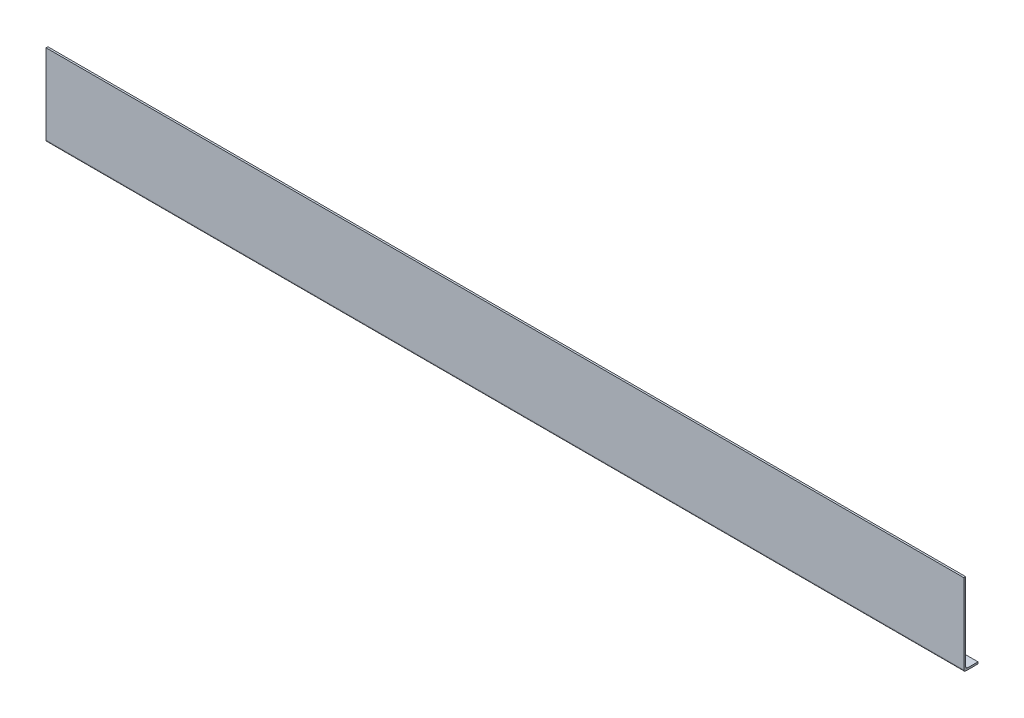
ISO-10303-21;
HEADER;
FILE_DESCRIPTION(('STEP AP214'),'2;1');
FILE_NAME('part.step','',(''),(''),'','','');
FILE_SCHEMA(('AUTOMOTIVE_DESIGN { 1 0 10303 214 1 1 1 1 }'));
ENDSEC;
DATA;
#1=APPLICATION_CONTEXT('core data for automotive mechanical design processes');
#2=APPLICATION_PROTOCOL_DEFINITION('international standard','automotive_design',2000,#1);
#3=PRODUCT_CONTEXT('',#1,'mechanical');
#4=PRODUCT('Part','Part','',(#3));
#5=PRODUCT_RELATED_PRODUCT_CATEGORY('part','',(#4));
#6=PRODUCT_DEFINITION_FORMATION('','',#4);
#7=PRODUCT_DEFINITION_CONTEXT('part definition',#1,'design');
#8=PRODUCT_DEFINITION('design','',#6,#7);
#9=PRODUCT_DEFINITION_SHAPE('','',#8);
#10=(LENGTH_UNIT() NAMED_UNIT(*) SI_UNIT(.MILLI.,.METRE.));
#11=(NAMED_UNIT(*) PLANE_ANGLE_UNIT() SI_UNIT($,.RADIAN.));
#12=(NAMED_UNIT(*) SI_UNIT($,.STERADIAN.) SOLID_ANGLE_UNIT());
#13=UNCERTAINTY_MEASURE_WITH_UNIT(LENGTH_MEASURE(1.E-05),#10,'distance_accuracy_value','');
#14=(GEOMETRIC_REPRESENTATION_CONTEXT(3) GLOBAL_UNCERTAINTY_ASSIGNED_CONTEXT((#13)) GLOBAL_UNIT_ASSIGNED_CONTEXT((#10,
#11,#12)) REPRESENTATION_CONTEXT('',''));
#15=CARTESIAN_POINT('',(0.,0.,0.));
#16=DIRECTION('',(0.,0.,1.));
#17=DIRECTION('',(1.,0.,0.));
#18=AXIS2_PLACEMENT_3D('',#15,#16,#17);
#19=CARTESIAN_POINT('',(1493.,3.,0.));
#20=DIRECTION('',(0.,0.,1.));
#21=DIRECTION('',(1.,0.,0.));
#22=AXIS2_PLACEMENT_3D('',#19,#20,#21);
#23=PLANE('',#22);
#24=DIRECTION('',(0.,1.,0.));
#25=VECTOR('',#24,1.);
#26=CARTESIAN_POINT('',(0.,3.,0.));
#27=LINE('',#26,#25);
#28=CARTESIAN_POINT('',(0.,0.,0.));
#29=VERTEX_POINT('',#28);
#30=CARTESIAN_POINT('',(0.,3.,0.));
#31=VERTEX_POINT('',#30);
#32=EDGE_CURVE('E123',#29,#31,#27,.T.);
#33=ORIENTED_EDGE('',*,*,#32,.T.);
#34=DIRECTION('',(-1.,0.,0.));
#35=VECTOR('',#34,1.);
#36=CARTESIAN_POINT('',(1493.,3.,0.));
#37=LINE('',#36,#35);
#38=CARTESIAN_POINT('',(1493.,3.,0.));
#39=VERTEX_POINT('',#38);
#40=EDGE_CURVE('E104',#39,#31,#37,.T.);
#41=ORIENTED_EDGE('',*,*,#40,.F.);
#42=DIRECTION('',(0.,1.,0.));
#43=VECTOR('',#42,1.);
#44=CARTESIAN_POINT('',(1493.,3.,0.));
#45=LINE('',#44,#43);
#46=CARTESIAN_POINT('',(1493.,0.,0.));
#47=VERTEX_POINT('',#46);
#48=EDGE_CURVE('E111',#47,#39,#45,.T.);
#49=ORIENTED_EDGE('',*,*,#48,.F.);
#50=DIRECTION('',(-1.,0.,0.));
#51=VECTOR('',#50,1.);
#52=CARTESIAN_POINT('',(1493.,0.,0.));
#53=LINE('',#52,#51);
#54=EDGE_CURVE('E162',#47,#29,#53,.T.);
#55=ORIENTED_EDGE('',*,*,#54,.T.);
#56=EDGE_LOOP('',(#33,#41,#49,#55));
#57=FACE_BOUND('',#56,.T.);
#58=ADVANCED_FACE('F33',(#57),#23,.F.);
#59=CARTESIAN_POINT('',(1493.,3.,0.));
#60=DIRECTION('',(0.,-1.,0.));
#61=DIRECTION('',(0.,0.,-1.));
#62=AXIS2_PLACEMENT_3D('',#59,#60,#61);
#63=PLANE('',#62);
#64=DIRECTION('',(0.,0.,1.));
#65=VECTOR('',#64,1.);
#66=CARTESIAN_POINT('',(0.,3.,0.));
#67=LINE('',#66,#65);
#68=CARTESIAN_POINT('',(0.,3.,17.));
#69=VERTEX_POINT('',#68);
#70=EDGE_CURVE('E143',#31,#69,#67,.T.);
#71=ORIENTED_EDGE('',*,*,#70,.T.);
#72=DIRECTION('',(-1.,0.,0.));
#73=VECTOR('',#72,1.);
#74=CARTESIAN_POINT('',(1493.,3.,17.));
#75=LINE('',#74,#73);
#76=CARTESIAN_POINT('',(1493.,3.,17.));
#77=VERTEX_POINT('',#76);
#78=EDGE_CURVE('E107',#69,#77,#75,.F.);
#79=ORIENTED_EDGE('',*,*,#78,.T.);
#80=DIRECTION('',(0.,0.,1.));
#81=VECTOR('',#80,1.);
#82=CARTESIAN_POINT('',(1493.,3.,0.));
#83=LINE('',#82,#81);
#84=EDGE_CURVE('E99',#39,#77,#83,.T.);
#85=ORIENTED_EDGE('',*,*,#84,.F.);
#86=ORIENTED_EDGE('',*,*,#40,.T.);
#87=EDGE_LOOP('',(#71,#79,#85,#86));
#88=FACE_BOUND('',#87,.T.);
#89=ADVANCED_FACE('F102',(#88),#63,.F.);
#90=CARTESIAN_POINT('',(1493.,3.,20.));
#91=DIRECTION('',(0.,0.,1.));
#92=DIRECTION('',(1.,0.,0.));
#93=AXIS2_PLACEMENT_3D('',#90,#91,#92);
#94=PLANE('',#93);
#95=DIRECTION('',(0.,1.,0.));
#96=VECTOR('',#95,1.);
#97=CARTESIAN_POINT('',(1493.,3.,20.));
#98=LINE('',#97,#96);
#99=CARTESIAN_POINT('',(1493.,6.,20.));
#100=VERTEX_POINT('',#99);
#101=CARTESIAN_POINT('',(1493.,133.,20.));
#102=VERTEX_POINT('',#101);
#103=EDGE_CURVE('E110',#100,#102,#98,.T.);
#104=ORIENTED_EDGE('',*,*,#103,.F.);
#105=DIRECTION('',(-1.,0.,0.));
#106=VECTOR('',#105,1.);
#107=CARTESIAN_POINT('',(0.,6.,20.));
#108=LINE('',#107,#106);
#109=CARTESIAN_POINT('',(0.,6.,20.));
#110=VERTEX_POINT('',#109);
#111=EDGE_CURVE('E124',#100,#110,#108,.T.);
#112=ORIENTED_EDGE('',*,*,#111,.T.);
#113=DIRECTION('',(0.,1.,0.));
#114=VECTOR('',#113,1.);
#115=CARTESIAN_POINT('',(0.,3.,20.));
#116=LINE('',#115,#114);
#117=CARTESIAN_POINT('',(0.,133.,20.));
#118=VERTEX_POINT('',#117);
#119=EDGE_CURVE('E145',#110,#118,#116,.T.);
#120=ORIENTED_EDGE('',*,*,#119,.T.);
#121=DIRECTION('',(-1.,0.,0.));
#122=VECTOR('',#121,1.);
#123=CARTESIAN_POINT('',(1493.,133.,20.));
#124=LINE('',#123,#122);
#125=EDGE_CURVE('E125',#102,#118,#124,.T.);
#126=ORIENTED_EDGE('',*,*,#125,.F.);
#127=EDGE_LOOP('',(#104,#112,#120,#126));
#128=FACE_BOUND('',#127,.T.);
#129=ADVANCED_FACE('F153',(#128),#94,.F.);
#130=CARTESIAN_POINT('',(1493.,133.,23.));
#131=DIRECTION('',(0.,-1.,0.));
#132=DIRECTION('',(0.,0.,-1.));
#133=AXIS2_PLACEMENT_3D('',#130,#131,#132);
#134=PLANE('',#133);
#135=DIRECTION('',(0.,0.,1.));
#136=VECTOR('',#135,1.);
#137=CARTESIAN_POINT('',(0.,133.,23.));
#138=LINE('',#137,#136);
#139=CARTESIAN_POINT('',(0.,133.,23.));
#140=VERTEX_POINT('',#139);
#141=EDGE_CURVE('E165',#118,#140,#138,.T.);
#142=ORIENTED_EDGE('',*,*,#141,.T.);
#143=DIRECTION('',(-1.,0.,0.));
#144=VECTOR('',#143,1.);
#145=CARTESIAN_POINT('',(1493.,133.,23.));
#146=LINE('',#145,#144);
#147=CARTESIAN_POINT('',(1493.,133.,23.));
#148=VERTEX_POINT('',#147);
#149=EDGE_CURVE('E130',#148,#140,#146,.T.);
#150=ORIENTED_EDGE('',*,*,#149,.F.);
#151=DIRECTION('',(0.,0.,1.));
#152=VECTOR('',#151,1.);
#153=CARTESIAN_POINT('',(1493.,133.,23.));
#154=LINE('',#153,#152);
#155=EDGE_CURVE('E155',#102,#148,#154,.T.);
#156=ORIENTED_EDGE('',*,*,#155,.F.);
#157=ORIENTED_EDGE('',*,*,#125,.T.);
#158=EDGE_LOOP('',(#142,#150,#156,#157));
#159=FACE_BOUND('',#158,.T.);
#160=ADVANCED_FACE('F174',(#159),#134,.F.);
#161=CARTESIAN_POINT('',(1493.,0.,23.));
#162=DIRECTION('',(0.,0.,-1.));
#163=DIRECTION('',(-1.,0.,0.));
#164=AXIS2_PLACEMENT_3D('',#161,#162,#163);
#165=PLANE('',#164);
#166=DIRECTION('',(0.,-1.,0.));
#167=VECTOR('',#166,1.);
#168=CARTESIAN_POINT('',(0.,0.,23.));
#169=LINE('',#168,#167);
#170=CARTESIAN_POINT('',(0.,3.,23.));
#171=VERTEX_POINT('',#170);
#172=EDGE_CURVE('E167',#140,#171,#169,.T.);
#173=ORIENTED_EDGE('',*,*,#172,.T.);
#174=DIRECTION('',(-1.,0.,0.));
#175=VECTOR('',#174,1.);
#176=CARTESIAN_POINT('',(1493.,3.,23.));
#177=LINE('',#176,#175);
#178=CARTESIAN_POINT('',(1493.,3.,23.));
#179=VERTEX_POINT('',#178);
#180=EDGE_CURVE('E48',#171,#179,#177,.F.);
#181=ORIENTED_EDGE('',*,*,#180,.T.);
#182=DIRECTION('',(0.,-1.,0.));
#183=VECTOR('',#182,1.);
#184=CARTESIAN_POINT('',(1493.,0.,23.));
#185=LINE('',#184,#183);
#186=EDGE_CURVE('E157',#148,#179,#185,.T.);
#187=ORIENTED_EDGE('',*,*,#186,.F.);
#188=ORIENTED_EDGE('',*,*,#149,.T.);
#189=EDGE_LOOP('',(#173,#181,#187,#188));
#190=FACE_BOUND('',#189,.T.);
#191=ADVANCED_FACE('F172',(#190),#165,.F.);
#192=CARTESIAN_POINT('',(1493.,0.,0.));
#193=DIRECTION('',(0.,1.,0.));
#194=DIRECTION('',(0.,0.,1.));
#195=AXIS2_PLACEMENT_3D('',#192,#193,#194);
#196=PLANE('',#195);
#197=DIRECTION('',(0.,0.,-1.));
#198=VECTOR('',#197,1.);
#199=CARTESIAN_POINT('',(1493.,0.,0.));
#200=LINE('',#199,#198);
#201=CARTESIAN_POINT('',(1493.,0.,20.));
#202=VERTEX_POINT('',#201);
#203=EDGE_CURVE('E116',#202,#47,#200,.T.);
#204=ORIENTED_EDGE('',*,*,#203,.F.);
#205=DIRECTION('',(-1.,0.,0.));
#206=VECTOR('',#205,1.);
#207=CARTESIAN_POINT('',(1493.,0.,20.));
#208=LINE('',#207,#206);
#209=CARTESIAN_POINT('',(0.,0.,20.));
#210=VERTEX_POINT('',#209);
#211=EDGE_CURVE('E135',#202,#210,#208,.T.);
#212=ORIENTED_EDGE('',*,*,#211,.T.);
#213=DIRECTION('',(0.,0.,-1.));
#214=VECTOR('',#213,1.);
#215=CARTESIAN_POINT('',(0.,0.,0.));
#216=LINE('',#215,#214);
#217=EDGE_CURVE('E120',#210,#29,#216,.T.);
#218=ORIENTED_EDGE('',*,*,#217,.T.);
#219=ORIENTED_EDGE('',*,*,#54,.F.);
#220=EDGE_LOOP('',(#204,#212,#218,#219));
#221=FACE_BOUND('',#220,.T.);
#222=ADVANCED_FACE('F179',(#221),#196,.F.);
#223=CARTESIAN_POINT('',(1493.,0.,0.));
#224=DIRECTION('',(-1.,0.,0.));
#225=DIRECTION('',(0.,0.,1.));
#226=AXIS2_PLACEMENT_3D('',#223,#224,#225);
#227=PLANE('',#226);
#228=ORIENTED_EDGE('',*,*,#186,.T.);
#229=CARTESIAN_POINT('',(1493.,3.,20.));
#230=DIRECTION('',(-1.,0.,0.));
#231=DIRECTION('',(0.,0.,1.));
#232=AXIS2_PLACEMENT_3D('',#229,#230,#231);
#233=CIRCLE('',#232,3.);
#234=EDGE_CURVE('E140',#179,#202,#233,.F.);
#235=ORIENTED_EDGE('',*,*,#234,.T.);
#236=ORIENTED_EDGE('',*,*,#203,.T.);
#237=ORIENTED_EDGE('',*,*,#48,.T.);
#238=ORIENTED_EDGE('',*,*,#84,.T.);
#239=CARTESIAN_POINT('',(1493.,6.,17.));
#240=DIRECTION('',(-1.,0.,0.));
#241=DIRECTION('',(0.,0.,1.));
#242=AXIS2_PLACEMENT_3D('',#239,#240,#241);
#243=CIRCLE('',#242,3.);
#244=EDGE_CURVE('E11',#77,#100,#243,.T.);
#245=ORIENTED_EDGE('',*,*,#244,.T.);
#246=ORIENTED_EDGE('',*,*,#103,.T.);
#247=ORIENTED_EDGE('',*,*,#155,.T.);
#248=EDGE_LOOP('',(#228,#235,#236,#237,#238,#245,#246,#247));
#249=FACE_BOUND('',#248,.T.);
#250=ADVANCED_FACE('F114',(#249),#227,.F.);
#251=CARTESIAN_POINT('',(0.,0.,0.));
#252=DIRECTION('',(-1.,0.,0.));
#253=DIRECTION('',(0.,0.,1.));
#254=AXIS2_PLACEMENT_3D('',#251,#252,#253);
#255=PLANE('',#254);
#256=ORIENTED_EDGE('',*,*,#217,.F.);
#257=CARTESIAN_POINT('',(0.,3.,20.));
#258=DIRECTION('',(-1.,0.,0.));
#259=DIRECTION('',(0.,0.,1.));
#260=AXIS2_PLACEMENT_3D('',#257,#258,#259);
#261=CIRCLE('',#260,3.);
#262=EDGE_CURVE('E56',#210,#171,#261,.T.);
#263=ORIENTED_EDGE('',*,*,#262,.T.);
#264=ORIENTED_EDGE('',*,*,#172,.F.);
#265=ORIENTED_EDGE('',*,*,#141,.F.);
#266=ORIENTED_EDGE('',*,*,#119,.F.);
#267=CARTESIAN_POINT('',(0.,6.,17.));
#268=DIRECTION('',(-1.,0.,0.));
#269=DIRECTION('',(0.,0.,1.));
#270=AXIS2_PLACEMENT_3D('',#267,#268,#269);
#271=CIRCLE('',#270,3.);
#272=EDGE_CURVE('E41',#110,#69,#271,.F.);
#273=ORIENTED_EDGE('',*,*,#272,.T.);
#274=ORIENTED_EDGE('',*,*,#70,.F.);
#275=ORIENTED_EDGE('',*,*,#32,.F.);
#276=EDGE_LOOP('',(#256,#263,#264,#265,#266,#273,#274,#275));
#277=FACE_BOUND('',#276,.T.);
#278=ADVANCED_FACE('F142',(#277),#255,.T.);
#279=CARTESIAN_POINT('',(1493.,6.,17.));
#280=DIRECTION('',(1.,0.,0.));
#281=DIRECTION('',(0.,0.,-1.));
#282=AXIS2_PLACEMENT_3D('',#279,#280,#281);
#283=CYLINDRICAL_SURFACE('',#282,3.);
#284=ORIENTED_EDGE('',*,*,#244,.F.);
#285=ORIENTED_EDGE('',*,*,#78,.F.);
#286=ORIENTED_EDGE('',*,*,#272,.F.);
#287=ORIENTED_EDGE('',*,*,#111,.F.);
#288=EDGE_LOOP('',(#284,#285,#286,#287));
#289=FACE_BOUND('',#288,.T.);
#290=ADVANCED_FACE('F149',(#289),#283,.F.);
#291=CARTESIAN_POINT('',(1493.,3.,20.));
#292=DIRECTION('',(-1.,0.,0.));
#293=DIRECTION('',(0.,0.,1.));
#294=AXIS2_PLACEMENT_3D('',#291,#292,#293);
#295=CYLINDRICAL_SURFACE('',#294,3.);
#296=ORIENTED_EDGE('',*,*,#234,.F.);
#297=ORIENTED_EDGE('',*,*,#180,.F.);
#298=ORIENTED_EDGE('',*,*,#262,.F.);
#299=ORIENTED_EDGE('',*,*,#211,.F.);
#300=EDGE_LOOP('',(#296,#297,#298,#299));
#301=FACE_BOUND('',#300,.T.);
#302=ADVANCED_FACE('F35',(#301),#295,.T.);
#303=CLOSED_SHELL('',(#58,#89,#129,#160,#191,#222,#250,#278,#290,#302));
#304=MANIFOLD_SOLID_BREP('B2',#303);
#305=ADVANCED_BREP_SHAPE_REPRESENTATION('',(#18,#304),#14);
#306=SHAPE_DEFINITION_REPRESENTATION(#9,#305);
ENDSEC;
END-ISO-10303-21;
